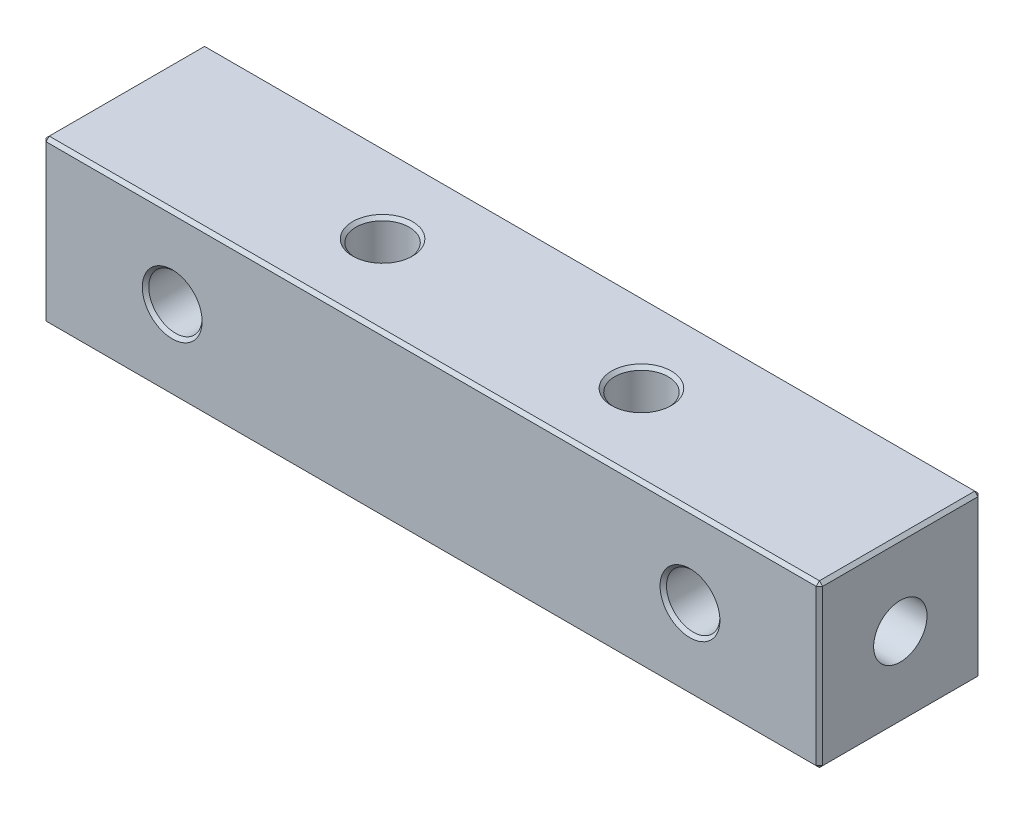
ISO-10303-21;
HEADER;
FILE_DESCRIPTION(('STEP AP214'),'2;1');
FILE_NAME('part.step','',(''),(''),'','','');
FILE_SCHEMA(('AUTOMOTIVE_DESIGN { 1 0 10303 214 1 1 1 1 }'));
ENDSEC;
DATA;
#1=APPLICATION_CONTEXT('core data for automotive mechanical design processes');
#2=APPLICATION_PROTOCOL_DEFINITION('international standard','automotive_design',2000,#1);
#3=PRODUCT_CONTEXT('',#1,'mechanical');
#4=PRODUCT('Part','Part','',(#3));
#5=PRODUCT_RELATED_PRODUCT_CATEGORY('part','',(#4));
#6=PRODUCT_DEFINITION_FORMATION('','',#4);
#7=PRODUCT_DEFINITION_CONTEXT('part definition',#1,'design');
#8=PRODUCT_DEFINITION('design','',#6,#7);
#9=PRODUCT_DEFINITION_SHAPE('','',#8);
#10=(LENGTH_UNIT() NAMED_UNIT(*) SI_UNIT(.MILLI.,.METRE.));
#11=(NAMED_UNIT(*) PLANE_ANGLE_UNIT() SI_UNIT($,.RADIAN.));
#12=(NAMED_UNIT(*) SI_UNIT($,.STERADIAN.) SOLID_ANGLE_UNIT());
#13=UNCERTAINTY_MEASURE_WITH_UNIT(LENGTH_MEASURE(1.E-05),#10,'distance_accuracy_value','');
#14=(GEOMETRIC_REPRESENTATION_CONTEXT(3) GLOBAL_UNCERTAINTY_ASSIGNED_CONTEXT((#13)) GLOBAL_UNIT_ASSIGNED_CONTEXT((#10,
#11,#12)) REPRESENTATION_CONTEXT('',''));
#15=CARTESIAN_POINT('',(0.,0.,0.));
#16=DIRECTION('',(0.,0.,1.));
#17=DIRECTION('',(1.,0.,0.));
#18=AXIS2_PLACEMENT_3D('',#15,#16,#17);
#19=CARTESIAN_POINT('',(24.,5.,-5.));
#20=DIRECTION('',(-1.,0.,0.));
#21=DIRECTION('',(0.,0.,1.));
#22=AXIS2_PLACEMENT_3D('',#19,#20,#21);
#23=PLANE('',#22);
#24=DIRECTION('',(0.,-1.,0.));
#25=VECTOR('',#24,1.);
#26=CARTESIAN_POINT('',(24.,5.,4.8));
#27=LINE('',#26,#25);
#28=CARTESIAN_POINT('',(24.,4.8,4.8));
#29=VERTEX_POINT('',#28);
#30=CARTESIAN_POINT('',(24.,-4.8,4.8));
#31=VERTEX_POINT('',#30);
#32=EDGE_CURVE('E191',#29,#31,#27,.T.);
#33=ORIENTED_EDGE('',*,*,#32,.T.);
#34=DIRECTION('',(0.,0.,-1.));
#35=VECTOR('',#34,1.);
#36=CARTESIAN_POINT('',(24.,-4.8,-5.));
#37=LINE('',#36,#35);
#38=CARTESIAN_POINT('',(24.,-4.8,-4.8));
#39=VERTEX_POINT('',#38);
#40=EDGE_CURVE('E193',#31,#39,#37,.T.);
#41=ORIENTED_EDGE('',*,*,#40,.T.);
#42=DIRECTION('',(0.,1.,0.));
#43=VECTOR('',#42,1.);
#44=CARTESIAN_POINT('',(24.,5.,-4.8));
#45=LINE('',#44,#43);
#46=CARTESIAN_POINT('',(24.,4.8,-4.8));
#47=VERTEX_POINT('',#46);
#48=EDGE_CURVE('E187',#39,#47,#45,.T.);
#49=ORIENTED_EDGE('',*,*,#48,.T.);
#50=DIRECTION('',(0.,0.,1.));
#51=VECTOR('',#50,1.);
#52=CARTESIAN_POINT('',(24.,4.8,5.));
#53=LINE('',#52,#51);
#54=EDGE_CURVE('E189',#47,#29,#53,.T.);
#55=ORIENTED_EDGE('',*,*,#54,.T.);
#56=EDGE_LOOP('',(#33,#41,#49,#55));
#57=FACE_BOUND('',#56,.T.);
#58=CARTESIAN_POINT('',(24.,0.,0.));
#59=DIRECTION('',(1.,0.,0.));
#60=DIRECTION('',(0.,0.,-1.));
#61=AXIS2_PLACEMENT_3D('',#58,#59,#60);
#62=CIRCLE('',#61,1.65);
#63=CARTESIAN_POINT('',(24.,0.,-1.65));
#64=VERTEX_POINT('',#63);
#65=EDGE_CURVE('E291',#64,#64,#62,.T.);
#66=ORIENTED_EDGE('',*,*,#65,.F.);
#67=EDGE_LOOP('',(#66));
#68=FACE_BOUND('',#67,.T.);
#69=ADVANCED_FACE('F41',(#57,#68),#23,.F.);
#70=CARTESIAN_POINT('',(-24.,5.,-5.));
#71=DIRECTION('',(1.,0.,0.));
#72=DIRECTION('',(0.,0.,-1.));
#73=AXIS2_PLACEMENT_3D('',#70,#71,#72);
#74=PLANE('',#73);
#75=DIRECTION('',(0.,-1.,0.));
#76=VECTOR('',#75,1.);
#77=CARTESIAN_POINT('',(-24.,5.,-4.8));
#78=LINE('',#77,#76);
#79=CARTESIAN_POINT('',(-24.,4.8,-4.8));
#80=VERTEX_POINT('',#79);
#81=CARTESIAN_POINT('',(-24.,-4.8,-4.8));
#82=VERTEX_POINT('',#81);
#83=EDGE_CURVE('E178',#80,#82,#78,.T.);
#84=ORIENTED_EDGE('',*,*,#83,.T.);
#85=DIRECTION('',(0.,0.,1.));
#86=VECTOR('',#85,1.);
#87=CARTESIAN_POINT('',(-24.,-4.8,-5.));
#88=LINE('',#87,#86);
#89=CARTESIAN_POINT('',(-24.,-4.8,4.8));
#90=VERTEX_POINT('',#89);
#91=EDGE_CURVE('E184',#82,#90,#88,.T.);
#92=ORIENTED_EDGE('',*,*,#91,.T.);
#93=DIRECTION('',(0.,1.,0.));
#94=VECTOR('',#93,1.);
#95=CARTESIAN_POINT('',(-24.,5.,4.8));
#96=LINE('',#95,#94);
#97=CARTESIAN_POINT('',(-24.,4.8,4.8));
#98=VERTEX_POINT('',#97);
#99=EDGE_CURVE('E182',#90,#98,#96,.T.);
#100=ORIENTED_EDGE('',*,*,#99,.T.);
#101=DIRECTION('',(0.,0.,-1.));
#102=VECTOR('',#101,1.);
#103=CARTESIAN_POINT('',(-24.,4.8,-5.));
#104=LINE('',#103,#102);
#105=EDGE_CURVE('E180',#98,#80,#104,.T.);
#106=ORIENTED_EDGE('',*,*,#105,.T.);
#107=EDGE_LOOP('',(#84,#92,#100,#106));
#108=FACE_BOUND('',#107,.T.);
#109=CARTESIAN_POINT('',(-24.,0.,0.));
#110=DIRECTION('',(-1.,0.,0.));
#111=DIRECTION('',(0.,0.,1.));
#112=AXIS2_PLACEMENT_3D('',#109,#110,#111);
#113=CIRCLE('',#112,1.65);
#114=CARTESIAN_POINT('',(-24.,0.,1.65));
#115=VERTEX_POINT('',#114);
#116=EDGE_CURVE('E215',#115,#115,#113,.T.);
#117=ORIENTED_EDGE('',*,*,#116,.F.);
#118=EDGE_LOOP('',(#117));
#119=FACE_BOUND('',#118,.T.);
#120=ADVANCED_FACE('F356',(#108,#119),#74,.F.);
#121=CARTESIAN_POINT('',(-24.,5.,-5.));
#122=DIRECTION('',(0.,0.,1.));
#123=DIRECTION('',(1.,0.,0.));
#124=AXIS2_PLACEMENT_3D('',#121,#122,#123);
#125=PLANE('',#124);
#126=DIRECTION('',(1.,0.,0.));
#127=VECTOR('',#126,1.);
#128=CARTESIAN_POINT('',(24.,4.8,-5.));
#129=LINE('',#128,#127);
#130=CARTESIAN_POINT('',(-23.8,4.8,-5.));
#131=VERTEX_POINT('',#130);
#132=CARTESIAN_POINT('',(23.8,4.8,-5.));
#133=VERTEX_POINT('',#132);
#134=EDGE_CURVE('E206',#131,#133,#129,.T.);
#135=ORIENTED_EDGE('',*,*,#134,.T.);
#136=DIRECTION('',(0.,-1.,0.));
#137=VECTOR('',#136,1.);
#138=CARTESIAN_POINT('',(23.8,5.,-5.));
#139=LINE('',#138,#137);
#140=CARTESIAN_POINT('',(23.8,-4.8,-5.));
#141=VERTEX_POINT('',#140);
#142=EDGE_CURVE('E208',#133,#141,#139,.T.);
#143=ORIENTED_EDGE('',*,*,#142,.T.);
#144=DIRECTION('',(-1.,0.,0.));
#145=VECTOR('',#144,1.);
#146=CARTESIAN_POINT('',(-24.,-4.8,-5.));
#147=LINE('',#146,#145);
#148=CARTESIAN_POINT('',(-23.8,-4.8,-5.));
#149=VERTEX_POINT('',#148);
#150=EDGE_CURVE('E202',#141,#149,#147,.T.);
#151=ORIENTED_EDGE('',*,*,#150,.T.);
#152=DIRECTION('',(0.,1.,0.));
#153=VECTOR('',#152,1.);
#154=CARTESIAN_POINT('',(-23.8,5.,-5.));
#155=LINE('',#154,#153);
#156=EDGE_CURVE('E204',#149,#131,#155,.T.);
#157=ORIENTED_EDGE('',*,*,#156,.T.);
#158=EDGE_LOOP('',(#135,#143,#151,#157));
#159=FACE_BOUND('',#158,.T.);
#160=CARTESIAN_POINT('',(-16.,0.,-5.));
#161=DIRECTION('',(0.,0.,1.));
#162=DIRECTION('',(1.,0.,0.));
#163=AXIS2_PLACEMENT_3D('',#160,#161,#162);
#164=CIRCLE('',#163,1.84999999999999);
#165=CARTESIAN_POINT('',(-14.15,0.,-5.));
#166=VERTEX_POINT('',#165);
#167=EDGE_CURVE('E199',#166,#166,#164,.T.);
#168=ORIENTED_EDGE('',*,*,#167,.T.);
#169=EDGE_LOOP('',(#168));
#170=FACE_BOUND('',#169,.T.);
#171=CARTESIAN_POINT('',(16.,0.,-5.));
#172=DIRECTION('',(0.,0.,1.));
#173=DIRECTION('',(1.,0.,0.));
#174=AXIS2_PLACEMENT_3D('',#171,#172,#173);
#175=CIRCLE('',#174,1.84999999999999);
#176=CARTESIAN_POINT('',(17.85,0.,-5.));
#177=VERTEX_POINT('',#176);
#178=EDGE_CURVE('E196',#177,#177,#175,.T.);
#179=ORIENTED_EDGE('',*,*,#178,.T.);
#180=EDGE_LOOP('',(#179));
#181=FACE_BOUND('',#180,.T.);
#182=ADVANCED_FACE('F362',(#159,#170,#181),#125,.F.);
#183=CARTESIAN_POINT('',(-24.,5.,5.));
#184=DIRECTION('',(0.,0.,-1.));
#185=DIRECTION('',(-1.,0.,0.));
#186=AXIS2_PLACEMENT_3D('',#183,#184,#185);
#187=PLANE('',#186);
#188=CARTESIAN_POINT('',(-16.,0.,5.));
#189=DIRECTION('',(0.,0.,-1.));
#190=DIRECTION('',(-1.,0.,0.));
#191=AXIS2_PLACEMENT_3D('',#188,#189,#190);
#192=CIRCLE('',#191,1.85);
#193=CARTESIAN_POINT('',(-17.85,0.,5.));
#194=VERTEX_POINT('',#193);
#195=EDGE_CURVE('E334',#194,#194,#192,.T.);
#196=ORIENTED_EDGE('',*,*,#195,.T.);
#197=EDGE_LOOP('',(#196));
#198=FACE_BOUND('',#197,.T.);
#199=CARTESIAN_POINT('',(16.,0.,5.));
#200=DIRECTION('',(0.,0.,-1.));
#201=DIRECTION('',(-1.,0.,0.));
#202=AXIS2_PLACEMENT_3D('',#199,#200,#201);
#203=CIRCLE('',#202,1.85);
#204=CARTESIAN_POINT('',(14.15,0.,5.));
#205=VERTEX_POINT('',#204);
#206=EDGE_CURVE('E331',#205,#205,#203,.T.);
#207=ORIENTED_EDGE('',*,*,#206,.T.);
#208=EDGE_LOOP('',(#207));
#209=FACE_BOUND('',#208,.T.);
#210=DIRECTION('',(-1.,0.,0.));
#211=VECTOR('',#210,1.);
#212=CARTESIAN_POINT('',(-24.,4.8,5.));
#213=LINE('',#212,#211);
#214=CARTESIAN_POINT('',(23.8,4.8,5.));
#215=VERTEX_POINT('',#214);
#216=CARTESIAN_POINT('',(-23.8,4.8,5.));
#217=VERTEX_POINT('',#216);
#218=EDGE_CURVE('E322',#215,#217,#213,.T.);
#219=ORIENTED_EDGE('',*,*,#218,.T.);
#220=DIRECTION('',(0.,-1.,0.));
#221=VECTOR('',#220,1.);
#222=CARTESIAN_POINT('',(-23.8,5.,5.));
#223=LINE('',#222,#221);
#224=CARTESIAN_POINT('',(-23.8,-4.8,5.));
#225=VERTEX_POINT('',#224);
#226=EDGE_CURVE('E328',#217,#225,#223,.T.);
#227=ORIENTED_EDGE('',*,*,#226,.T.);
#228=DIRECTION('',(1.,0.,0.));
#229=VECTOR('',#228,1.);
#230=CARTESIAN_POINT('',(-24.,-4.8,5.));
#231=LINE('',#230,#229);
#232=CARTESIAN_POINT('',(23.8,-4.8,5.));
#233=VERTEX_POINT('',#232);
#234=EDGE_CURVE('E326',#225,#233,#231,.T.);
#235=ORIENTED_EDGE('',*,*,#234,.T.);
#236=DIRECTION('',(0.,1.,0.));
#237=VECTOR('',#236,1.);
#238=CARTESIAN_POINT('',(23.8,5.,5.));
#239=LINE('',#238,#237);
#240=EDGE_CURVE('E324',#233,#215,#239,.T.);
#241=ORIENTED_EDGE('',*,*,#240,.T.);
#242=EDGE_LOOP('',(#219,#227,#235,#241));
#243=FACE_BOUND('',#242,.T.);
#244=ADVANCED_FACE('F591',(#198,#209,#243),#187,.F.);
#245=CARTESIAN_POINT('',(0.,5.,0.));
#246=DIRECTION('',(0.,1.,0.));
#247=DIRECTION('',(0.,0.,1.));
#248=AXIS2_PLACEMENT_3D('',#245,#246,#247);
#249=PLANE('',#248);
#250=CARTESIAN_POINT('',(8.,5.,0.));
#251=DIRECTION('',(0.,1.,0.));
#252=DIRECTION('',(0.,0.,1.));
#253=AXIS2_PLACEMENT_3D('',#250,#251,#252);
#254=CIRCLE('',#253,1.84999999999999);
#255=CARTESIAN_POINT('',(8.,5.,1.84999999999999));
#256=VERTEX_POINT('',#255);
#257=EDGE_CURVE('E175',#256,#256,#254,.F.);
#258=ORIENTED_EDGE('',*,*,#257,.T.);
#259=EDGE_LOOP('',(#258));
#260=FACE_BOUND('',#259,.T.);
#261=CARTESIAN_POINT('',(-8.,5.,0.));
#262=DIRECTION('',(0.,1.,0.));
#263=DIRECTION('',(0.,0.,1.));
#264=AXIS2_PLACEMENT_3D('',#261,#262,#263);
#265=CIRCLE('',#264,1.84999999999999);
#266=CARTESIAN_POINT('',(-8.,5.,1.84999999999999));
#267=VERTEX_POINT('',#266);
#268=EDGE_CURVE('E172',#267,#267,#265,.F.);
#269=ORIENTED_EDGE('',*,*,#268,.T.);
#270=EDGE_LOOP('',(#269));
#271=FACE_BOUND('',#270,.T.);
#272=DIRECTION('',(0.,0.,1.));
#273=VECTOR('',#272,1.);
#274=CARTESIAN_POINT('',(-23.8,5.,5.));
#275=LINE('',#274,#273);
#276=CARTESIAN_POINT('',(-23.8,5.,-4.8));
#277=VERTEX_POINT('',#276);
#278=CARTESIAN_POINT('',(-23.8,5.,4.8));
#279=VERTEX_POINT('',#278);
#280=EDGE_CURVE('E167',#277,#279,#275,.T.);
#281=ORIENTED_EDGE('',*,*,#280,.T.);
#282=DIRECTION('',(1.,0.,0.));
#283=VECTOR('',#282,1.);
#284=CARTESIAN_POINT('',(24.,5.,4.8));
#285=LINE('',#284,#283);
#286=CARTESIAN_POINT('',(23.8,5.,4.8));
#287=VERTEX_POINT('',#286);
#288=EDGE_CURVE('E169',#279,#287,#285,.T.);
#289=ORIENTED_EDGE('',*,*,#288,.T.);
#290=DIRECTION('',(0.,0.,-1.));
#291=VECTOR('',#290,1.);
#292=CARTESIAN_POINT('',(23.8,5.,-5.));
#293=LINE('',#292,#291);
#294=CARTESIAN_POINT('',(23.8,5.,-4.8));
#295=VERTEX_POINT('',#294);
#296=EDGE_CURVE('E165',#287,#295,#293,.T.);
#297=ORIENTED_EDGE('',*,*,#296,.T.);
#298=DIRECTION('',(-1.,0.,0.));
#299=VECTOR('',#298,1.);
#300=CARTESIAN_POINT('',(-24.,5.,-4.8));
#301=LINE('',#300,#299);
#302=EDGE_CURVE('E157',#295,#277,#301,.T.);
#303=ORIENTED_EDGE('',*,*,#302,.T.);
#304=EDGE_LOOP('',(#281,#289,#297,#303));
#305=FACE_BOUND('',#304,.T.);
#306=ADVANCED_FACE('F556',(#260,#271,#305),#249,.T.);
#307=CARTESIAN_POINT('',(0.,-5.,0.));
#308=DIRECTION('',(0.,1.,0.));
#309=DIRECTION('',(0.,0.,1.));
#310=AXIS2_PLACEMENT_3D('',#307,#308,#309);
#311=PLANE('',#310);
#312=CARTESIAN_POINT('',(8.,-5.,0.));
#313=DIRECTION('',(0.,1.,0.));
#314=DIRECTION('',(0.,0.,1.));
#315=AXIS2_PLACEMENT_3D('',#312,#313,#314);
#316=CIRCLE('',#315,1.85);
#317=CARTESIAN_POINT('',(8.,-5.,1.85));
#318=VERTEX_POINT('',#317);
#319=EDGE_CURVE('E307',#318,#318,#316,.T.);
#320=ORIENTED_EDGE('',*,*,#319,.T.);
#321=EDGE_LOOP('',(#320));
#322=FACE_BOUND('',#321,.T.);
#323=CARTESIAN_POINT('',(-8.,-5.,0.));
#324=DIRECTION('',(0.,1.,0.));
#325=DIRECTION('',(0.,0.,1.));
#326=AXIS2_PLACEMENT_3D('',#323,#324,#325);
#327=CIRCLE('',#326,1.85);
#328=CARTESIAN_POINT('',(-8.,-5.,-1.85));
#329=VERTEX_POINT('',#328);
#330=EDGE_CURVE('E304',#329,#329,#327,.T.);
#331=ORIENTED_EDGE('',*,*,#330,.T.);
#332=EDGE_LOOP('',(#331));
#333=FACE_BOUND('',#332,.T.);
#334=DIRECTION('',(0.,0.,1.));
#335=VECTOR('',#334,1.);
#336=CARTESIAN_POINT('',(23.8,-5.,0.));
#337=LINE('',#336,#335);
#338=CARTESIAN_POINT('',(23.8,-5.,-4.8));
#339=VERTEX_POINT('',#338);
#340=CARTESIAN_POINT('',(23.8,-5.,4.8));
#341=VERTEX_POINT('',#340);
#342=EDGE_CURVE('E297',#339,#341,#337,.T.);
#343=ORIENTED_EDGE('',*,*,#342,.T.);
#344=DIRECTION('',(-1.,0.,0.));
#345=VECTOR('',#344,1.);
#346=CARTESIAN_POINT('',(0.,-5.,4.8));
#347=LINE('',#346,#345);
#348=CARTESIAN_POINT('',(-23.8,-5.,4.8));
#349=VERTEX_POINT('',#348);
#350=EDGE_CURVE('E302',#341,#349,#347,.T.);
#351=ORIENTED_EDGE('',*,*,#350,.T.);
#352=DIRECTION('',(0.,0.,-1.));
#353=VECTOR('',#352,1.);
#354=CARTESIAN_POINT('',(-23.8,-5.,0.));
#355=LINE('',#354,#353);
#356=CARTESIAN_POINT('',(-23.8,-5.,-4.8));
#357=VERTEX_POINT('',#356);
#358=EDGE_CURVE('E299',#349,#357,#355,.T.);
#359=ORIENTED_EDGE('',*,*,#358,.T.);
#360=DIRECTION('',(1.,0.,0.));
#361=VECTOR('',#360,1.);
#362=CARTESIAN_POINT('',(0.,-5.,-4.8));
#363=LINE('',#362,#361);
#364=EDGE_CURVE('E280',#357,#339,#363,.T.);
#365=ORIENTED_EDGE('',*,*,#364,.T.);
#366=EDGE_LOOP('',(#343,#351,#359,#365));
#367=FACE_BOUND('',#366,.T.);
#368=ADVANCED_FACE('F596',(#322,#333,#367),#311,.F.);
#369=CARTESIAN_POINT('',(8.,5.,0.));
#370=DIRECTION('',(0.,1.,0.));
#371=DIRECTION('',(0.,0.,1.));
#372=AXIS2_PLACEMENT_3D('',#369,#370,#371);
#373=CYLINDRICAL_SURFACE('',#372,1.65);
#374=CARTESIAN_POINT('',(8.,-4.79999999999999,0.));
#375=DIRECTION('',(0.,1.,0.));
#376=DIRECTION('',(0.,0.,1.));
#377=AXIS2_PLACEMENT_3D('',#374,#375,#376);
#378=CIRCLE('',#377,1.65);
#379=CARTESIAN_POINT('',(8.,-4.79999999999999,1.65));
#380=VERTEX_POINT('',#379);
#381=EDGE_CURVE('E313',#380,#380,#378,.F.);
#382=ORIENTED_EDGE('',*,*,#381,.T.);
#383=EDGE_LOOP('',(#382));
#384=FACE_BOUND('',#383,.T.);
#385=CARTESIAN_POINT('',(8.,4.80000000000001,0.));
#386=DIRECTION('',(0.,1.,0.));
#387=DIRECTION('',(0.,0.,1.));
#388=AXIS2_PLACEMENT_3D('',#385,#386,#387);
#389=CIRCLE('',#388,1.65);
#390=CARTESIAN_POINT('',(8.,4.80000000000001,1.65));
#391=VERTEX_POINT('',#390);
#392=EDGE_CURVE('E310',#391,#391,#389,.T.);
#393=ORIENTED_EDGE('',*,*,#392,.T.);
#394=EDGE_LOOP('',(#393));
#395=FACE_BOUND('',#394,.T.);
#396=ADVANCED_FACE('F600',(#384,#395),#373,.F.);
#397=CARTESIAN_POINT('',(-8.,5.,0.));
#398=DIRECTION('',(0.,1.,0.));
#399=DIRECTION('',(0.,0.,1.));
#400=AXIS2_PLACEMENT_3D('',#397,#398,#399);
#401=CYLINDRICAL_SURFACE('',#400,1.65);
#402=CARTESIAN_POINT('',(-8.,-4.80000000000001,0.));
#403=DIRECTION('',(0.,1.,0.));
#404=DIRECTION('',(0.,0.,1.));
#405=AXIS2_PLACEMENT_3D('',#402,#403,#404);
#406=CIRCLE('',#405,1.65);
#407=CARTESIAN_POINT('',(-8.,-4.80000000000001,-1.65));
#408=VERTEX_POINT('',#407);
#409=EDGE_CURVE('E319',#408,#408,#406,.F.);
#410=ORIENTED_EDGE('',*,*,#409,.T.);
#411=EDGE_LOOP('',(#410));
#412=FACE_BOUND('',#411,.T.);
#413=CARTESIAN_POINT('',(-8.,4.80000000000001,0.));
#414=DIRECTION('',(0.,1.,0.));
#415=DIRECTION('',(0.,0.,1.));
#416=AXIS2_PLACEMENT_3D('',#413,#414,#415);
#417=CIRCLE('',#416,1.65);
#418=CARTESIAN_POINT('',(-8.,4.80000000000001,1.65));
#419=VERTEX_POINT('',#418);
#420=EDGE_CURVE('E316',#419,#419,#417,.T.);
#421=ORIENTED_EDGE('',*,*,#420,.T.);
#422=EDGE_LOOP('',(#421));
#423=FACE_BOUND('',#422,.T.);
#424=ADVANCED_FACE('F607',(#412,#423),#401,.F.);
#425=CARTESIAN_POINT('',(-16.,0.,-5.));
#426=DIRECTION('',(0.,0.,-1.));
#427=DIRECTION('',(-1.,0.,0.));
#428=AXIS2_PLACEMENT_3D('',#425,#426,#427);
#429=CYLINDRICAL_SURFACE('',#428,1.65);
#430=CARTESIAN_POINT('',(-16.,0.,0.));
#431=DIRECTION('',(0.707106781186547,0.,-0.707106781186547));
#432=DIRECTION('',(-0.707106781186547,0.,-0.707106781186547));
#433=AXIS2_PLACEMENT_3D('',#430,#431,#432);
#434=ELLIPSE('',#433,2.3334523779156,1.65);
#435=CARTESIAN_POINT('',(-16.,1.65,0.));
#436=VERTEX_POINT('',#435);
#437=CARTESIAN_POINT('',(-16.,-1.65,0.));
#438=VERTEX_POINT('',#437);
#439=EDGE_CURVE('E211',#436,#438,#434,.F.);
#440=ORIENTED_EDGE('',*,*,#439,.T.);
#441=CARTESIAN_POINT('',(-16.,0.,0.));
#442=DIRECTION('',(-0.707106781186547,0.,-0.707106781186547));
#443=DIRECTION('',(0.707106781186547,0.,-0.707106781186547));
#444=AXIS2_PLACEMENT_3D('',#441,#442,#443);
#445=ELLIPSE('',#444,2.3334523779156,1.65);
#446=EDGE_CURVE('E61',#438,#436,#445,.T.);
#447=ORIENTED_EDGE('',*,*,#446,.T.);
#448=EDGE_LOOP('',(#440,#447));
#449=FACE_BOUND('',#448,.T.);
#450=CARTESIAN_POINT('',(-16.,0.,4.8));
#451=DIRECTION('',(0.,0.,-1.));
#452=DIRECTION('',(-1.,0.,0.));
#453=AXIS2_PLACEMENT_3D('',#450,#451,#452);
#454=CIRCLE('',#453,1.65);
#455=CARTESIAN_POINT('',(-17.65,0.,4.8));
#456=VERTEX_POINT('',#455);
#457=EDGE_CURVE('E155',#456,#456,#454,.F.);
#458=ORIENTED_EDGE('',*,*,#457,.T.);
#459=EDGE_LOOP('',(#458));
#460=FACE_BOUND('',#459,.T.);
#461=CARTESIAN_POINT('',(-16.,0.,-4.80000000000001));
#462=DIRECTION('',(0.,0.,1.));
#463=DIRECTION('',(1.,0.,0.));
#464=AXIS2_PLACEMENT_3D('',#461,#462,#463);
#465=CIRCLE('',#464,1.65);
#466=CARTESIAN_POINT('',(-14.35,0.,-4.80000000000001));
#467=VERTEX_POINT('',#466);
#468=EDGE_CURVE('E160',#467,#467,#465,.F.);
#469=ORIENTED_EDGE('',*,*,#468,.T.);
#470=EDGE_LOOP('',(#469));
#471=FACE_BOUND('',#470,.T.);
#472=ADVANCED_FACE('F145',(#449,#460,#471),#429,.F.);
#473=CARTESIAN_POINT('',(16.,0.,-5.));
#474=DIRECTION('',(0.,0.,-1.));
#475=DIRECTION('',(-1.,0.,0.));
#476=AXIS2_PLACEMENT_3D('',#473,#474,#475);
#477=CYLINDRICAL_SURFACE('',#476,1.65);
#478=CARTESIAN_POINT('',(16.,0.,0.));
#479=DIRECTION('',(-0.707106781186547,0.,-0.707106781186547));
#480=DIRECTION('',(0.707106781186547,0.,-0.707106781186547));
#481=AXIS2_PLACEMENT_3D('',#478,#479,#480);
#482=ELLIPSE('',#481,2.3334523779156,1.65);
#483=CARTESIAN_POINT('',(16.,-1.65,0.));
#484=VERTEX_POINT('',#483);
#485=CARTESIAN_POINT('',(16.,1.65,0.));
#486=VERTEX_POINT('',#485);
#487=EDGE_CURVE('E50',#484,#486,#482,.F.);
#488=ORIENTED_EDGE('',*,*,#487,.T.);
#489=CARTESIAN_POINT('',(16.,0.,0.));
#490=DIRECTION('',(0.707106781186547,0.,-0.707106781186547));
#491=DIRECTION('',(-0.707106781186547,0.,-0.707106781186547));
#492=AXIS2_PLACEMENT_3D('',#489,#490,#491);
#493=ELLIPSE('',#492,2.3334523779156,1.65);
#494=EDGE_CURVE('E11',#486,#484,#493,.T.);
#495=ORIENTED_EDGE('',*,*,#494,.T.);
#496=EDGE_LOOP('',(#488,#495));
#497=FACE_BOUND('',#496,.T.);
#498=CARTESIAN_POINT('',(16.,0.,4.8));
#499=DIRECTION('',(0.,0.,-1.));
#500=DIRECTION('',(-1.,0.,0.));
#501=AXIS2_PLACEMENT_3D('',#498,#499,#500);
#502=CIRCLE('',#501,1.65);
#503=CARTESIAN_POINT('',(14.35,0.,4.8));
#504=VERTEX_POINT('',#503);
#505=EDGE_CURVE('E150',#504,#504,#502,.F.);
#506=ORIENTED_EDGE('',*,*,#505,.T.);
#507=EDGE_LOOP('',(#506));
#508=FACE_BOUND('',#507,.T.);
#509=CARTESIAN_POINT('',(16.,0.,-4.80000000000001));
#510=DIRECTION('',(0.,0.,1.));
#511=DIRECTION('',(1.,0.,0.));
#512=AXIS2_PLACEMENT_3D('',#509,#510,#511);
#513=CIRCLE('',#512,1.65);
#514=CARTESIAN_POINT('',(17.65,0.,-4.80000000000001));
#515=VERTEX_POINT('',#514);
#516=EDGE_CURVE('E153',#515,#515,#513,.F.);
#517=ORIENTED_EDGE('',*,*,#516,.T.);
#518=EDGE_LOOP('',(#517));
#519=FACE_BOUND('',#518,.T.);
#520=ADVANCED_FACE('F141',(#497,#508,#519),#477,.F.);
#521=CARTESIAN_POINT('',(8.,-5.,0.));
#522=DIRECTION('',(0.,-1.,0.));
#523=DIRECTION('',(0.,0.,-1.));
#524=AXIS2_PLACEMENT_3D('',#521,#522,#523);
#525=CONICAL_SURFACE('',#524,1.85,0.785398163397447);
#526=ORIENTED_EDGE('',*,*,#381,.F.);
#527=EDGE_LOOP('',(#526));
#528=FACE_BOUND('',#527,.T.);
#529=ORIENTED_EDGE('',*,*,#319,.F.);
#530=EDGE_LOOP('',(#529));
#531=FACE_BOUND('',#530,.T.);
#532=ADVANCED_FACE('F144',(#528,#531),#525,.F.);
#533=CARTESIAN_POINT('',(-8.,-5.,0.));
#534=DIRECTION('',(0.,-1.,0.));
#535=DIRECTION('',(0.,0.,-1.));
#536=AXIS2_PLACEMENT_3D('',#533,#534,#535);
#537=CONICAL_SURFACE('',#536,1.85,0.785398163397462);
#538=CARTESIAN_POINT('',(-8.,-4.80000000000001,-1.65));
#539=CARTESIAN_POINT('',(-8.,-4.80208333333334,-1.65208333333333));
#540=CARTESIAN_POINT('',(-8.,-4.80416666666667,-1.65416666666666));
#541=CARTESIAN_POINT('',(-8.,-4.80833333333334,-1.65833333333333));
#542=CARTESIAN_POINT('',(-8.,-4.81041666666667,-1.66041666666666));
#543=CARTESIAN_POINT('',(-8.,-4.81458333333334,-1.66458333333333));
#544=CARTESIAN_POINT('',(-8.,-4.81666666666667,-1.66666666666666));
#545=CARTESIAN_POINT('',(-8.,-4.82083333333334,-1.67083333333333));
#546=CARTESIAN_POINT('',(-8.,-4.82291666666667,-1.67291666666666));
#547=CARTESIAN_POINT('',(-8.,-4.82708333333334,-1.67708333333333));
#548=CARTESIAN_POINT('',(-8.,-4.82916666666667,-1.67916666666666));
#549=CARTESIAN_POINT('',(-8.,-4.83333333333334,-1.68333333333333));
#550=CARTESIAN_POINT('',(-8.,-4.83541666666667,-1.68541666666666));
#551=CARTESIAN_POINT('',(-8.,-4.83958333333334,-1.68958333333333));
#552=CARTESIAN_POINT('',(-8.,-4.84166666666667,-1.69166666666666));
#553=CARTESIAN_POINT('',(-8.,-4.84583333333334,-1.69583333333333));
#554=CARTESIAN_POINT('',(-8.,-4.84791666666667,-1.69791666666666));
#555=CARTESIAN_POINT('',(-8.,-4.85208333333334,-1.70208333333333));
#556=CARTESIAN_POINT('',(-8.,-4.85416666666667,-1.70416666666666));
#557=CARTESIAN_POINT('',(-8.,-4.85833333333334,-1.70833333333333));
#558=CARTESIAN_POINT('',(-8.,-4.86041666666667,-1.71041666666666));
#559=CARTESIAN_POINT('',(-8.,-4.86458333333334,-1.71458333333333));
#560=CARTESIAN_POINT('',(-8.,-4.86666666666667,-1.71666666666666));
#561=CARTESIAN_POINT('',(-8.,-4.87083333333334,-1.72083333333333));
#562=CARTESIAN_POINT('',(-8.,-4.87291666666667,-1.72291666666666));
#563=CARTESIAN_POINT('',(-8.,-4.87708333333334,-1.72708333333333));
#564=CARTESIAN_POINT('',(-8.,-4.87916666666667,-1.72916666666666));
#565=CARTESIAN_POINT('',(-8.,-4.88333333333334,-1.73333333333333));
#566=CARTESIAN_POINT('',(-8.,-4.88541666666667,-1.73541666666666));
#567=CARTESIAN_POINT('',(-8.,-4.88958333333334,-1.73958333333333));
#568=CARTESIAN_POINT('',(-8.,-4.89166666666667,-1.74166666666666));
#569=CARTESIAN_POINT('',(-8.,-4.89583333333334,-1.74583333333333));
#570=CARTESIAN_POINT('',(-8.,-4.89791666666667,-1.74791666666666));
#571=CARTESIAN_POINT('',(-8.,-4.90208333333334,-1.75208333333333));
#572=CARTESIAN_POINT('',(-8.,-4.90416666666667,-1.75416666666666));
#573=CARTESIAN_POINT('',(-8.,-4.90833333333334,-1.75833333333333));
#574=CARTESIAN_POINT('',(-8.,-4.91041666666667,-1.76041666666666));
#575=CARTESIAN_POINT('',(-8.,-4.91458333333334,-1.76458333333333));
#576=CARTESIAN_POINT('',(-8.,-4.91666666666667,-1.76666666666666));
#577=CARTESIAN_POINT('',(-8.,-4.92083333333334,-1.77083333333333));
#578=CARTESIAN_POINT('',(-8.,-4.92291666666667,-1.77291666666666));
#579=CARTESIAN_POINT('',(-8.,-4.92708333333334,-1.77708333333333));
#580=CARTESIAN_POINT('',(-8.,-4.92916666666667,-1.77916666666666));
#581=CARTESIAN_POINT('',(-8.,-4.93333333333334,-1.78333333333333));
#582=CARTESIAN_POINT('',(-8.,-4.93541666666667,-1.78541666666666));
#583=CARTESIAN_POINT('',(-8.,-4.93958333333334,-1.78958333333333));
#584=CARTESIAN_POINT('',(-8.,-4.94166666666667,-1.79166666666666));
#585=CARTESIAN_POINT('',(-8.,-4.94583333333333,-1.79583333333333));
#586=CARTESIAN_POINT('',(-8.,-4.94791666666667,-1.79791666666666));
#587=CARTESIAN_POINT('',(-8.,-4.95208333333334,-1.80208333333333));
#588=CARTESIAN_POINT('',(-8.,-4.95416666666667,-1.80416666666666));
#589=CARTESIAN_POINT('',(-8.,-4.95833333333334,-1.80833333333333));
#590=CARTESIAN_POINT('',(-8.,-4.96041666666667,-1.81041666666666));
#591=CARTESIAN_POINT('',(-8.,-4.96458333333333,-1.81458333333333));
#592=CARTESIAN_POINT('',(-8.,-4.96666666666667,-1.81666666666666));
#593=CARTESIAN_POINT('',(-8.,-4.97083333333333,-1.82083333333333));
#594=CARTESIAN_POINT('',(-8.,-4.97291666666667,-1.82291666666666));
#595=CARTESIAN_POINT('',(-8.,-4.97708333333333,-1.82708333333333));
#596=CARTESIAN_POINT('',(-8.,-4.97916666666667,-1.82916666666666));
#597=CARTESIAN_POINT('',(-8.,-4.98333333333333,-1.83333333333333));
#598=CARTESIAN_POINT('',(-8.,-4.98541666666667,-1.83541666666666));
#599=CARTESIAN_POINT('',(-8.,-4.98958333333333,-1.83958333333333));
#600=CARTESIAN_POINT('',(-8.,-4.99166666666667,-1.84166666666666));
#601=CARTESIAN_POINT('',(-8.,-4.99583333333333,-1.84583333333333));
#602=CARTESIAN_POINT('',(-8.,-4.99791666666667,-1.84791666666666));
#603=CARTESIAN_POINT('',(-8.,-5.,-1.85));
#604=B_SPLINE_CURVE_WITH_KNOTS('',3,(#538,#539,#540,#541,#542,#543,#544,#545,#546,#547,#548,
#549,#550,#551,#552,#553,#554,#555,#556,#557,#558,#559,#560,#561,#562,#563,#564,#565,#566,#567,
#568,#569,#570,#571,#572,#573,#574,#575,#576,#577,#578,#579,#580,#581,#582,#583,#584,#585,#586,
#587,#588,#589,#590,#591,#592,#593,#594,#595,#596,#597,#598,#599,#600,#601,#602,#603),
.UNSPECIFIED.,.F.,.F.,(4,2,2,2,2,2,2,2,2,2,2,2,2,2,2,2,2,2,2,2,2,2,2,2,2,2,2,2,2,2,2,2,4),(0.,
0.00883883476483194,0.0176776695296639,0.0265165042944952,0.0353553390593272,0.0441941738241585,
0.0530330085889904,0.0618718433538218,0.0707106781186537,0.0795495128834856,0.088388347648317,
0.0972271824131489,0.10606601717798,0.114904851942812,0.123743686707644,0.132582521472476,
0.141421356237307,0.150260191002139,0.159099025766971,0.167937860531802,0.176776695296634,
0.185615530061465,0.194454364826297,0.203293199591129,0.212132034355961,0.220970869120793,
0.229809703885624,0.238648538650456,0.247487373415287,0.256326208180119,0.265165042944951,
0.274003877709783,0.282842712474614),.UNSPECIFIED.);
#605=EDGE_CURVE('BSEAM374',#408,#329,#604,.T.);
#606=ORIENTED_EDGE('',*,*,#409,.F.);
#607=ORIENTED_EDGE('',*,*,#330,.F.);
#608=ORIENTED_EDGE('',*,*,#605,.T.);
#609=ORIENTED_EDGE('',*,*,#605,.F.);
#610=EDGE_LOOP('',(#606,#608,#607,#609));
#611=FACE_BOUND('',#610,.T.);
#612=ADVANCED_FACE('F374',(#611),#537,.F.);
#613=CARTESIAN_POINT('',(-16.,0.,5.));
#614=DIRECTION('',(0.,0.,1.));
#615=DIRECTION('',(1.,0.,0.));
#616=AXIS2_PLACEMENT_3D('',#613,#614,#615);
#617=CONICAL_SURFACE('',#616,1.85,0.785398163397455);
#618=ORIENTED_EDGE('',*,*,#457,.F.);
#619=EDGE_LOOP('',(#618));
#620=FACE_BOUND('',#619,.T.);
#621=ORIENTED_EDGE('',*,*,#195,.F.);
#622=EDGE_LOOP('',(#621));
#623=FACE_BOUND('',#622,.T.);
#624=ADVANCED_FACE('F381',(#620,#623),#617,.F.);
#625=CARTESIAN_POINT('',(16.,0.,5.));
#626=DIRECTION('',(0.,0.,1.));
#627=DIRECTION('',(1.,0.,0.));
#628=AXIS2_PLACEMENT_3D('',#625,#626,#627);
#629=CONICAL_SURFACE('',#628,1.85,0.785398163397453);
#630=ORIENTED_EDGE('',*,*,#505,.F.);
#631=EDGE_LOOP('',(#630));
#632=FACE_BOUND('',#631,.T.);
#633=ORIENTED_EDGE('',*,*,#206,.F.);
#634=EDGE_LOOP('',(#633));
#635=FACE_BOUND('',#634,.T.);
#636=ADVANCED_FACE('F388',(#632,#635),#629,.F.);
#637=CARTESIAN_POINT('',(8.,4.80000000000001,0.));
#638=DIRECTION('',(0.,1.,0.));
#639=DIRECTION('',(0.,0.,1.));
#640=AXIS2_PLACEMENT_3D('',#637,#638,#639);
#641=CONICAL_SURFACE('',#640,1.65,0.785398163397461);
#642=ORIENTED_EDGE('',*,*,#257,.F.);
#643=EDGE_LOOP('',(#642));
#644=FACE_BOUND('',#643,.T.);
#645=ORIENTED_EDGE('',*,*,#392,.F.);
#646=EDGE_LOOP('',(#645));
#647=FACE_BOUND('',#646,.T.);
#648=ADVANCED_FACE('F395',(#644,#647),#641,.F.);
#649=CARTESIAN_POINT('',(-8.,4.80000000000001,0.));
#650=DIRECTION('',(0.,1.,0.));
#651=DIRECTION('',(0.,0.,1.));
#652=AXIS2_PLACEMENT_3D('',#649,#650,#651);
#653=CONICAL_SURFACE('',#652,1.65,0.78539816339746);
#654=ORIENTED_EDGE('',*,*,#268,.F.);
#655=EDGE_LOOP('',(#654));
#656=FACE_BOUND('',#655,.T.);
#657=ORIENTED_EDGE('',*,*,#420,.F.);
#658=EDGE_LOOP('',(#657));
#659=FACE_BOUND('',#658,.T.);
#660=ADVANCED_FACE('F402',(#656,#659),#653,.F.);
#661=CARTESIAN_POINT('',(23.8,5.,0.));
#662=DIRECTION('',(0.707106781186548,0.707106781186548,0.));
#663=DIRECTION('',(0.,0.,1.));
#664=AXIS2_PLACEMENT_3D('',#661,#662,#663);
#665=PLANE('',#664);
#666=DIRECTION('',(0.707106781186547,-0.707106781186547,0.));
#667=VECTOR('',#666,1.);
#668=CARTESIAN_POINT('',(23.8,5.,-4.8));
#669=LINE('',#668,#667);
#670=EDGE_CURVE('E277',#295,#47,#669,.T.);
#671=ORIENTED_EDGE('',*,*,#670,.F.);
#672=ORIENTED_EDGE('',*,*,#296,.F.);
#673=DIRECTION('',(-0.707106781186547,0.707106781186547,0.));
#674=VECTOR('',#673,1.);
#675=CARTESIAN_POINT('',(23.9,4.9,4.8));
#676=LINE('',#675,#674);
#677=EDGE_CURVE('E274',#29,#287,#676,.T.);
#678=ORIENTED_EDGE('',*,*,#677,.F.);
#679=ORIENTED_EDGE('',*,*,#54,.F.);
#680=EDGE_LOOP('',(#671,#672,#678,#679));
#681=FACE_BOUND('',#680,.T.);
#682=ADVANCED_FACE('F408',(#681),#665,.T.);
#683=CARTESIAN_POINT('',(23.8,5.,-4.8));
#684=DIRECTION('',(0.577350269189626,0.577350269189626,-0.577350269189626));
#685=DIRECTION('',(-0.707106781186548,0.,-0.707106781186548));
#686=AXIS2_PLACEMENT_3D('',#683,#684,#685);
#687=PLANE('',#686);
#688=DIRECTION('',(0.,0.707106781186547,0.707106781186547));
#689=VECTOR('',#688,1.);
#690=CARTESIAN_POINT('',(23.8,5.,-4.8));
#691=LINE('',#690,#689);
#692=EDGE_CURVE('E268',#295,#133,#691,.F.);
#693=ORIENTED_EDGE('',*,*,#692,.F.);
#694=ORIENTED_EDGE('',*,*,#670,.T.);
#695=DIRECTION('',(0.707106781186547,0.,0.707106781186547));
#696=VECTOR('',#695,1.);
#697=CARTESIAN_POINT('',(23.9,4.8,-4.9));
#698=LINE('',#697,#696);
#699=EDGE_CURVE('E271',#133,#47,#698,.T.);
#700=ORIENTED_EDGE('',*,*,#699,.F.);
#701=EDGE_LOOP('',(#693,#694,#700));
#702=FACE_BOUND('',#701,.T.);
#703=ADVANCED_FACE('F532',(#702),#687,.T.);
#704=CARTESIAN_POINT('',(23.8,4.8,5.));
#705=DIRECTION('',(0.577350269189626,0.577350269189626,0.577350269189626));
#706=DIRECTION('',(0.707106781186548,0.,-0.707106781186548));
#707=AXIS2_PLACEMENT_3D('',#704,#705,#706);
#708=PLANE('',#707);
#709=DIRECTION('',(-0.707106781186547,0.,0.707106781186547));
#710=VECTOR('',#709,1.);
#711=CARTESIAN_POINT('',(23.8,4.8,5.));
#712=LINE('',#711,#710);
#713=EDGE_CURVE('E263',#29,#215,#712,.T.);
#714=ORIENTED_EDGE('',*,*,#713,.F.);
#715=ORIENTED_EDGE('',*,*,#677,.T.);
#716=DIRECTION('',(0.,-0.707106781186547,0.707106781186547));
#717=VECTOR('',#716,1.);
#718=CARTESIAN_POINT('',(23.8,4.8,5.));
#719=LINE('',#718,#717);
#720=EDGE_CURVE('E266',#215,#287,#719,.F.);
#721=ORIENTED_EDGE('',*,*,#720,.F.);
#722=EDGE_LOOP('',(#714,#715,#721));
#723=FACE_BOUND('',#722,.T.);
#724=ADVANCED_FACE('F525',(#723),#708,.T.);
#725=CARTESIAN_POINT('',(23.8,5.,-5.));
#726=DIRECTION('',(-0.707106781186548,0.,0.707106781186548));
#727=DIRECTION('',(0.,-1.,0.));
#728=AXIS2_PLACEMENT_3D('',#725,#726,#727);
#729=PLANE('',#728);
#730=ORIENTED_EDGE('',*,*,#699,.T.);
#731=ORIENTED_EDGE('',*,*,#48,.F.);
#732=DIRECTION('',(-0.707106781186547,0.,-0.707106781186547));
#733=VECTOR('',#732,1.);
#734=CARTESIAN_POINT('',(24.,-4.8,-4.8));
#735=LINE('',#734,#733);
#736=EDGE_CURVE('E258',#141,#39,#735,.F.);
#737=ORIENTED_EDGE('',*,*,#736,.F.);
#738=ORIENTED_EDGE('',*,*,#142,.F.);
#739=EDGE_LOOP('',(#730,#731,#737,#738));
#740=FACE_BOUND('',#739,.T.);
#741=ADVANCED_FACE('F518',(#740),#729,.F.);
#742=CARTESIAN_POINT('',(0.,5.,-4.8));
#743=DIRECTION('',(0.,0.707106781186548,-0.707106781186548));
#744=DIRECTION('',(1.,0.,0.));
#745=AXIS2_PLACEMENT_3D('',#742,#743,#744);
#746=PLANE('',#745);
#747=ORIENTED_EDGE('',*,*,#692,.T.);
#748=ORIENTED_EDGE('',*,*,#134,.F.);
#749=DIRECTION('',(0.,-0.707106781186547,-0.707106781186547));
#750=VECTOR('',#749,1.);
#751=CARTESIAN_POINT('',(-23.8,4.9,-4.9));
#752=LINE('',#751,#750);
#753=EDGE_CURVE('E255',#277,#131,#752,.T.);
#754=ORIENTED_EDGE('',*,*,#753,.F.);
#755=ORIENTED_EDGE('',*,*,#302,.F.);
#756=EDGE_LOOP('',(#747,#748,#754,#755));
#757=FACE_BOUND('',#756,.T.);
#758=ADVANCED_FACE('F511',(#757),#746,.T.);
#759=CARTESIAN_POINT('',(-23.8,5.,0.));
#760=DIRECTION('',(-0.707106781186548,0.707106781186548,0.));
#761=DIRECTION('',(0.,0.,-1.));
#762=AXIS2_PLACEMENT_3D('',#759,#760,#761);
#763=PLANE('',#762);
#764=DIRECTION('',(-0.707106781186547,-0.707106781186547,0.));
#765=VECTOR('',#764,1.);
#766=CARTESIAN_POINT('',(-24.,4.8,4.8));
#767=LINE('',#766,#765);
#768=EDGE_CURVE('E249',#279,#98,#767,.T.);
#769=ORIENTED_EDGE('',*,*,#768,.F.);
#770=ORIENTED_EDGE('',*,*,#280,.F.);
#771=DIRECTION('',(0.707106781186547,0.707106781186547,0.));
#772=VECTOR('',#771,1.);
#773=CARTESIAN_POINT('',(-24.,4.8,-4.8));
#774=LINE('',#773,#772);
#775=EDGE_CURVE('E252',#80,#277,#774,.T.);
#776=ORIENTED_EDGE('',*,*,#775,.F.);
#777=ORIENTED_EDGE('',*,*,#105,.F.);
#778=EDGE_LOOP('',(#769,#770,#776,#777));
#779=FACE_BOUND('',#778,.T.);
#780=ADVANCED_FACE('F504',(#779),#763,.T.);
#781=CARTESIAN_POINT('',(0.,5.,4.8));
#782=DIRECTION('',(0.,0.707106781186548,0.707106781186548));
#783=DIRECTION('',(-1.,0.,0.));
#784=AXIS2_PLACEMENT_3D('',#781,#782,#783);
#785=PLANE('',#784);
#786=ORIENTED_EDGE('',*,*,#720,.T.);
#787=ORIENTED_EDGE('',*,*,#288,.F.);
#788=DIRECTION('',(0.,0.707106781186547,-0.707106781186547));
#789=VECTOR('',#788,1.);
#790=CARTESIAN_POINT('',(-23.8,4.9,4.9));
#791=LINE('',#790,#789);
#792=EDGE_CURVE('E246',#217,#279,#791,.T.);
#793=ORIENTED_EDGE('',*,*,#792,.F.);
#794=ORIENTED_EDGE('',*,*,#218,.F.);
#795=EDGE_LOOP('',(#786,#787,#793,#794));
#796=FACE_BOUND('',#795,.T.);
#797=ADVANCED_FACE('F497',(#796),#785,.T.);
#798=CARTESIAN_POINT('',(24.,5.,4.8));
#799=DIRECTION('',(-0.707106781186548,0.,-0.707106781186548));
#800=DIRECTION('',(0.,-1.,0.));
#801=AXIS2_PLACEMENT_3D('',#798,#799,#800);
#802=PLANE('',#801);
#803=ORIENTED_EDGE('',*,*,#713,.T.);
#804=ORIENTED_EDGE('',*,*,#240,.F.);
#805=DIRECTION('',(0.707106781186547,0.,-0.707106781186547));
#806=VECTOR('',#805,1.);
#807=CARTESIAN_POINT('',(23.9,-4.8,4.9));
#808=LINE('',#807,#806);
#809=EDGE_CURVE('E243',#31,#233,#808,.F.);
#810=ORIENTED_EDGE('',*,*,#809,.F.);
#811=ORIENTED_EDGE('',*,*,#32,.F.);
#812=EDGE_LOOP('',(#803,#804,#810,#811));
#813=FACE_BOUND('',#812,.T.);
#814=ADVANCED_FACE('F490',(#813),#802,.F.);
#815=CARTESIAN_POINT('',(24.,-4.8,-5.));
#816=DIRECTION('',(-0.707106781186548,0.707106781186548,0.));
#817=DIRECTION('',(0.,0.,-1.));
#818=AXIS2_PLACEMENT_3D('',#815,#816,#817);
#819=PLANE('',#818);
#820=DIRECTION('',(0.707106781186547,0.707106781186547,0.));
#821=VECTOR('',#820,1.);
#822=CARTESIAN_POINT('',(24.,-4.8,-4.8));
#823=LINE('',#822,#821);
#824=EDGE_CURVE('E260',#39,#339,#823,.F.);
#825=ORIENTED_EDGE('',*,*,#824,.F.);
#826=ORIENTED_EDGE('',*,*,#40,.F.);
#827=DIRECTION('',(-0.707106781186547,-0.707106781186547,0.));
#828=VECTOR('',#827,1.);
#829=CARTESIAN_POINT('',(23.8,-5.,4.8));
#830=LINE('',#829,#828);
#831=EDGE_CURVE('E240',#341,#31,#830,.F.);
#832=ORIENTED_EDGE('',*,*,#831,.F.);
#833=ORIENTED_EDGE('',*,*,#342,.F.);
#834=EDGE_LOOP('',(#825,#826,#832,#833));
#835=FACE_BOUND('',#834,.T.);
#836=ADVANCED_FACE('F483',(#835),#819,.F.);
#837=CARTESIAN_POINT('',(24.,-4.8,-4.8));
#838=DIRECTION('',(0.577350269189626,-0.577350269189626,-0.577350269189626));
#839=DIRECTION('',(-0.707106781186548,0.,-0.707106781186548));
#840=AXIS2_PLACEMENT_3D('',#837,#838,#839);
#841=PLANE('',#840);
#842=ORIENTED_EDGE('',*,*,#736,.T.);
#843=ORIENTED_EDGE('',*,*,#824,.T.);
#844=DIRECTION('',(0.,-0.707106781186547,0.707106781186547));
#845=VECTOR('',#844,1.);
#846=CARTESIAN_POINT('',(23.8,-4.9,-4.9));
#847=LINE('',#846,#845);
#848=EDGE_CURVE('E237',#141,#339,#847,.T.);
#849=ORIENTED_EDGE('',*,*,#848,.F.);
#850=EDGE_LOOP('',(#842,#843,#849));
#851=FACE_BOUND('',#850,.T.);
#852=ADVANCED_FACE('F476',(#851),#841,.T.);
#853=CARTESIAN_POINT('',(-24.,4.8,-4.8));
#854=DIRECTION('',(-0.577350269189626,0.577350269189626,-0.577350269189626));
#855=DIRECTION('',(-0.707106781186548,0.,0.707106781186548));
#856=AXIS2_PLACEMENT_3D('',#853,#854,#855);
#857=PLANE('',#856);
#858=ORIENTED_EDGE('',*,*,#775,.T.);
#859=ORIENTED_EDGE('',*,*,#753,.T.);
#860=DIRECTION('',(0.707106781186547,0.,-0.707106781186547));
#861=VECTOR('',#860,1.);
#862=CARTESIAN_POINT('',(-24.,4.8,-4.8));
#863=LINE('',#862,#861);
#864=EDGE_CURVE('E234',#80,#131,#863,.T.);
#865=ORIENTED_EDGE('',*,*,#864,.F.);
#866=EDGE_LOOP('',(#858,#859,#865));
#867=FACE_BOUND('',#866,.T.);
#868=ADVANCED_FACE('F469',(#867),#857,.T.);
#869=CARTESIAN_POINT('',(-24.,4.8,4.8));
#870=DIRECTION('',(-0.577350269189626,0.577350269189626,0.577350269189626));
#871=DIRECTION('',(0.707106781186548,0.,0.707106781186548));
#872=AXIS2_PLACEMENT_3D('',#869,#870,#871);
#873=PLANE('',#872);
#874=ORIENTED_EDGE('',*,*,#792,.T.);
#875=ORIENTED_EDGE('',*,*,#768,.T.);
#876=DIRECTION('',(-0.707106781186547,0.,-0.707106781186547));
#877=VECTOR('',#876,1.);
#878=CARTESIAN_POINT('',(-24.,4.8,4.8));
#879=LINE('',#878,#877);
#880=EDGE_CURVE('E231',#217,#98,#879,.T.);
#881=ORIENTED_EDGE('',*,*,#880,.F.);
#882=EDGE_LOOP('',(#874,#875,#881));
#883=FACE_BOUND('',#882,.T.);
#884=ADVANCED_FACE('F462',(#883),#873,.T.);
#885=CARTESIAN_POINT('',(23.8,-5.,4.8));
#886=DIRECTION('',(0.577350269189626,-0.577350269189626,0.577350269189626));
#887=DIRECTION('',(0.707106781186548,0.,-0.707106781186548));
#888=AXIS2_PLACEMENT_3D('',#885,#886,#887);
#889=PLANE('',#888);
#890=ORIENTED_EDGE('',*,*,#831,.T.);
#891=ORIENTED_EDGE('',*,*,#809,.T.);
#892=DIRECTION('',(0.,0.707106781186547,0.707106781186547));
#893=VECTOR('',#892,1.);
#894=CARTESIAN_POINT('',(23.8,-5.,4.8));
#895=LINE('',#894,#893);
#896=EDGE_CURVE('E228',#341,#233,#895,.T.);
#897=ORIENTED_EDGE('',*,*,#896,.F.);
#898=EDGE_LOOP('',(#890,#891,#897));
#899=FACE_BOUND('',#898,.T.);
#900=ADVANCED_FACE('F455',(#899),#889,.T.);
#901=CARTESIAN_POINT('',(-24.,-4.8,-5.));
#902=DIRECTION('',(0.,0.707106781186548,0.707106781186548));
#903=DIRECTION('',(-1.,0.,0.));
#904=AXIS2_PLACEMENT_3D('',#901,#902,#903);
#905=PLANE('',#904);
#906=ORIENTED_EDGE('',*,*,#848,.T.);
#907=ORIENTED_EDGE('',*,*,#364,.F.);
#908=DIRECTION('',(0.,0.707106781186547,-0.707106781186547));
#909=VECTOR('',#908,1.);
#910=CARTESIAN_POINT('',(-23.8,-5.,-4.8));
#911=LINE('',#910,#909);
#912=EDGE_CURVE('E225',#149,#357,#911,.F.);
#913=ORIENTED_EDGE('',*,*,#912,.F.);
#914=ORIENTED_EDGE('',*,*,#150,.F.);
#915=EDGE_LOOP('',(#906,#907,#913,#914));
#916=FACE_BOUND('',#915,.T.);
#917=ADVANCED_FACE('F448',(#916),#905,.F.);
#918=CARTESIAN_POINT('',(-24.,5.,-4.8));
#919=DIRECTION('',(0.707106781186548,0.,0.707106781186548));
#920=DIRECTION('',(0.,-1.,0.));
#921=AXIS2_PLACEMENT_3D('',#918,#919,#920);
#922=PLANE('',#921);
#923=ORIENTED_EDGE('',*,*,#864,.T.);
#924=ORIENTED_EDGE('',*,*,#156,.F.);
#925=DIRECTION('',(-0.707106781186547,0.,0.707106781186547));
#926=VECTOR('',#925,1.);
#927=CARTESIAN_POINT('',(-23.9,-4.8,-4.9));
#928=LINE('',#927,#926);
#929=EDGE_CURVE('E222',#82,#149,#928,.F.);
#930=ORIENTED_EDGE('',*,*,#929,.F.);
#931=ORIENTED_EDGE('',*,*,#83,.F.);
#932=EDGE_LOOP('',(#923,#924,#930,#931));
#933=FACE_BOUND('',#932,.T.);
#934=ADVANCED_FACE('F441',(#933),#922,.F.);
#935=CARTESIAN_POINT('',(-23.8,5.,5.));
#936=DIRECTION('',(0.707106781186548,0.,-0.707106781186548));
#937=DIRECTION('',(0.,-1.,0.));
#938=AXIS2_PLACEMENT_3D('',#935,#936,#937);
#939=PLANE('',#938);
#940=ORIENTED_EDGE('',*,*,#880,.T.);
#941=ORIENTED_EDGE('',*,*,#99,.F.);
#942=DIRECTION('',(0.707106781186547,0.,0.707106781186547));
#943=VECTOR('',#942,1.);
#944=CARTESIAN_POINT('',(-24.,-4.8,4.8));
#945=LINE('',#944,#943);
#946=EDGE_CURVE('E219',#225,#90,#945,.F.);
#947=ORIENTED_EDGE('',*,*,#946,.F.);
#948=ORIENTED_EDGE('',*,*,#226,.F.);
#949=EDGE_LOOP('',(#940,#941,#947,#948));
#950=FACE_BOUND('',#949,.T.);
#951=ADVANCED_FACE('F434',(#950),#939,.F.);
#952=CARTESIAN_POINT('',(-24.,-4.8,5.));
#953=DIRECTION('',(0.,0.707106781186548,-0.707106781186548));
#954=DIRECTION('',(1.,0.,0.));
#955=AXIS2_PLACEMENT_3D('',#952,#953,#954);
#956=PLANE('',#955);
#957=ORIENTED_EDGE('',*,*,#896,.T.);
#958=ORIENTED_EDGE('',*,*,#234,.F.);
#959=DIRECTION('',(0.,-0.707106781186547,-0.707106781186547));
#960=VECTOR('',#959,1.);
#961=CARTESIAN_POINT('',(-23.8,-4.9,4.9));
#962=LINE('',#961,#960);
#963=EDGE_CURVE('E217',#349,#225,#962,.F.);
#964=ORIENTED_EDGE('',*,*,#963,.F.);
#965=ORIENTED_EDGE('',*,*,#350,.F.);
#966=EDGE_LOOP('',(#957,#958,#964,#965));
#967=FACE_BOUND('',#966,.T.);
#968=ADVANCED_FACE('F427',(#967),#956,.F.);
#969=CARTESIAN_POINT('',(-23.8,-5.,-4.8));
#970=DIRECTION('',(-0.577350269189626,-0.577350269189626,-0.577350269189626));
#971=DIRECTION('',(-0.707106781186548,0.,0.707106781186548));
#972=AXIS2_PLACEMENT_3D('',#969,#970,#971);
#973=PLANE('',#972);
#974=ORIENTED_EDGE('',*,*,#929,.T.);
#975=ORIENTED_EDGE('',*,*,#912,.T.);
#976=DIRECTION('',(0.707106781186547,-0.707106781186547,0.));
#977=VECTOR('',#976,1.);
#978=CARTESIAN_POINT('',(-23.8,-5.,-4.8));
#979=LINE('',#978,#977);
#980=EDGE_CURVE('E214',#82,#357,#979,.T.);
#981=ORIENTED_EDGE('',*,*,#980,.F.);
#982=EDGE_LOOP('',(#974,#975,#981));
#983=FACE_BOUND('',#982,.T.);
#984=ADVANCED_FACE('F420',(#983),#973,.T.);
#985=CARTESIAN_POINT('',(-24.,-4.8,4.8));
#986=DIRECTION('',(-0.577350269189626,-0.577350269189626,0.577350269189626));
#987=DIRECTION('',(0.707106781186548,0.,0.707106781186548));
#988=AXIS2_PLACEMENT_3D('',#985,#986,#987);
#989=PLANE('',#988);
#990=ORIENTED_EDGE('',*,*,#963,.T.);
#991=ORIENTED_EDGE('',*,*,#946,.T.);
#992=DIRECTION('',(-0.707106781186547,0.707106781186547,0.));
#993=VECTOR('',#992,1.);
#994=CARTESIAN_POINT('',(-24.,-4.8,4.8));
#995=LINE('',#994,#993);
#996=EDGE_CURVE('E212',#349,#90,#995,.T.);
#997=ORIENTED_EDGE('',*,*,#996,.F.);
#998=EDGE_LOOP('',(#990,#991,#997));
#999=FACE_BOUND('',#998,.T.);
#1000=ADVANCED_FACE('F349',(#999),#989,.T.);
#1001=CARTESIAN_POINT('',(-24.,-4.8,-5.));
#1002=DIRECTION('',(0.707106781186548,0.707106781186548,0.));
#1003=DIRECTION('',(0.,0.,1.));
#1004=AXIS2_PLACEMENT_3D('',#1001,#1002,#1003);
#1005=PLANE('',#1004);
#1006=ORIENTED_EDGE('',*,*,#980,.T.);
#1007=ORIENTED_EDGE('',*,*,#358,.F.);
#1008=ORIENTED_EDGE('',*,*,#996,.T.);
#1009=ORIENTED_EDGE('',*,*,#91,.F.);
#1010=EDGE_LOOP('',(#1006,#1007,#1008,#1009));
#1011=FACE_BOUND('',#1010,.T.);
#1012=ADVANCED_FACE('F342',(#1011),#1005,.F.);
#1013=CARTESIAN_POINT('',(-16.,0.,-4.80000000000001));
#1014=DIRECTION('',(0.,0.,-1.));
#1015=DIRECTION('',(-1.,0.,0.));
#1016=AXIS2_PLACEMENT_3D('',#1013,#1014,#1015);
#1017=CONICAL_SURFACE('',#1016,1.65,0.785398163397461);
#1018=ORIENTED_EDGE('',*,*,#167,.F.);
#1019=EDGE_LOOP('',(#1018));
#1020=FACE_BOUND('',#1019,.T.);
#1021=ORIENTED_EDGE('',*,*,#468,.F.);
#1022=EDGE_LOOP('',(#1021));
#1023=FACE_BOUND('',#1022,.T.);
#1024=ADVANCED_FACE('F340',(#1020,#1023),#1017,.F.);
#1025=CARTESIAN_POINT('',(16.,0.,-4.80000000000001));
#1026=DIRECTION('',(0.,0.,-1.));
#1027=DIRECTION('',(-1.,0.,0.));
#1028=AXIS2_PLACEMENT_3D('',#1025,#1026,#1027);
#1029=CONICAL_SURFACE('',#1028,1.65,0.785398163397461);
#1030=ORIENTED_EDGE('',*,*,#178,.F.);
#1031=EDGE_LOOP('',(#1030));
#1032=FACE_BOUND('',#1031,.T.);
#1033=ORIENTED_EDGE('',*,*,#516,.F.);
#1034=EDGE_LOOP('',(#1033));
#1035=FACE_BOUND('',#1034,.T.);
#1036=ADVANCED_FACE('F44',(#1032,#1035),#1029,.F.);
#1037=CARTESIAN_POINT('',(-24.,0.,0.));
#1038=DIRECTION('',(-1.,0.,0.));
#1039=DIRECTION('',(0.,0.,1.));
#1040=AXIS2_PLACEMENT_3D('',#1037,#1038,#1039);
#1041=CYLINDRICAL_SURFACE('',#1040,1.65);
#1042=ORIENTED_EDGE('',*,*,#439,.F.);
#1043=ORIENTED_EDGE('',*,*,#446,.F.);
#1044=EDGE_LOOP('',(#1042,#1043));
#1045=FACE_BOUND('',#1044,.T.);
#1046=ORIENTED_EDGE('',*,*,#116,.T.);
#1047=EDGE_LOOP('',(#1046));
#1048=FACE_BOUND('',#1047,.T.);
#1049=ADVANCED_FACE('F284',(#1045,#1048),#1041,.F.);
#1050=CARTESIAN_POINT('',(24.,0.,0.));
#1051=DIRECTION('',(1.,0.,0.));
#1052=DIRECTION('',(0.,0.,-1.));
#1053=AXIS2_PLACEMENT_3D('',#1050,#1051,#1052);
#1054=CYLINDRICAL_SURFACE('',#1053,1.65);
#1055=ORIENTED_EDGE('',*,*,#487,.F.);
#1056=ORIENTED_EDGE('',*,*,#494,.F.);
#1057=EDGE_LOOP('',(#1055,#1056));
#1058=FACE_BOUND('',#1057,.T.);
#1059=ORIENTED_EDGE('',*,*,#65,.T.);
#1060=EDGE_LOOP('',(#1059));
#1061=FACE_BOUND('',#1060,.T.);
#1062=ADVANCED_FACE('F138',(#1058,#1061),#1054,.F.);
#1063=CLOSED_SHELL('',(#69,#120,#182,#244,#306,#368,#396,#424,#472,#520,#532,#612,#624,#636,
#648,#660,#682,#703,#724,#741,#758,#780,#797,#814,#836,#852,#868,#884,#900,#917,#934,#951,#968,
#984,#1000,#1012,#1024,#1036,#1049,#1062));
#1064=MANIFOLD_SOLID_BREP('B2',#1063);
#1065=ADVANCED_BREP_SHAPE_REPRESENTATION('',(#18,#1064),#14);
#1066=SHAPE_DEFINITION_REPRESENTATION(#9,#1065);
ENDSEC;
END-ISO-10303-21;
